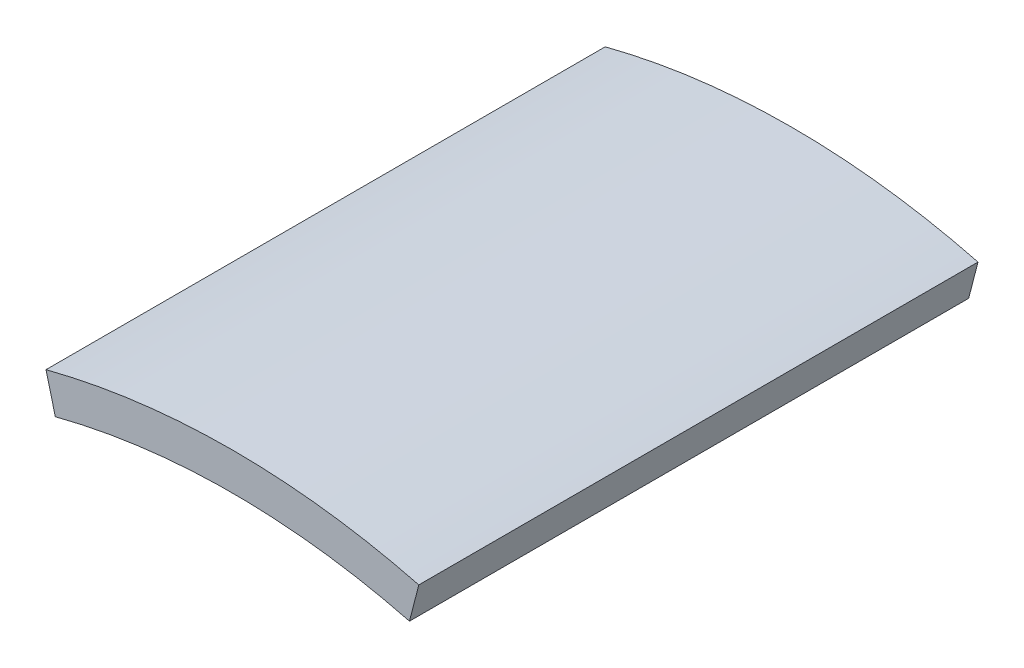
ISO-10303-21;
HEADER;
FILE_DESCRIPTION(('STEP AP214'),'2;1');
FILE_NAME('part.step','',(''),(''),'','','');
FILE_SCHEMA(('AUTOMOTIVE_DESIGN { 1 0 10303 214 1 1 1 1 }'));
ENDSEC;
DATA;
#1=APPLICATION_CONTEXT('core data for automotive mechanical design processes');
#2=APPLICATION_PROTOCOL_DEFINITION('international standard','automotive_design',2000,#1);
#3=PRODUCT_CONTEXT('',#1,'mechanical');
#4=PRODUCT('Part','Part','',(#3));
#5=PRODUCT_RELATED_PRODUCT_CATEGORY('part','',(#4));
#6=PRODUCT_DEFINITION_FORMATION('','',#4);
#7=PRODUCT_DEFINITION_CONTEXT('part definition',#1,'design');
#8=PRODUCT_DEFINITION('design','',#6,#7);
#9=PRODUCT_DEFINITION_SHAPE('','',#8);
#10=(LENGTH_UNIT() NAMED_UNIT(*) SI_UNIT(.MILLI.,.METRE.));
#11=(NAMED_UNIT(*) PLANE_ANGLE_UNIT() SI_UNIT($,.RADIAN.));
#12=(NAMED_UNIT(*) SI_UNIT($,.STERADIAN.) SOLID_ANGLE_UNIT());
#13=UNCERTAINTY_MEASURE_WITH_UNIT(LENGTH_MEASURE(1.E-05),#10,'distance_accuracy_value','');
#14=(GEOMETRIC_REPRESENTATION_CONTEXT(3) GLOBAL_UNCERTAINTY_ASSIGNED_CONTEXT((#13)) GLOBAL_UNIT_ASSIGNED_CONTEXT((#10,
#11,#12)) REPRESENTATION_CONTEXT('',''));
#15=CARTESIAN_POINT('',(0.,0.,0.));
#16=DIRECTION('',(0.,0.,1.));
#17=DIRECTION('',(1.,0.,0.));
#18=AXIS2_PLACEMENT_3D('',#15,#16,#17);
#19=CARTESIAN_POINT('',(10.,-38.7298334620742,30.));
#20=DIRECTION('',(0.,0.,-1.));
#21=DIRECTION('',(-1.,0.,0.));
#22=AXIS2_PLACEMENT_3D('',#19,#20,#21);
#23=CYLINDRICAL_SURFACE('',#22,40.);
#24=CARTESIAN_POINT('',(10.,-38.7298334620742,0.));
#25=DIRECTION('',(0.,0.,1.));
#26=DIRECTION('',(-1.,0.,0.));
#27=AXIS2_PLACEMENT_3D('',#24,#25,#26);
#28=CIRCLE('',#27,40.);
#29=CARTESIAN_POINT('',(20.,0.,0.));
#30=VERTEX_POINT('',#29);
#31=CARTESIAN_POINT('',(0.,0.,0.));
#32=VERTEX_POINT('',#31);
#33=EDGE_CURVE('E96',#30,#32,#28,.T.);
#34=ORIENTED_EDGE('',*,*,#33,.T.);
#35=DIRECTION('',(0.,0.,-1.));
#36=VECTOR('',#35,1.);
#37=CARTESIAN_POINT('',(0.,0.,30.));
#38=LINE('',#37,#36);
#39=CARTESIAN_POINT('',(0.,0.,30.));
#40=VERTEX_POINT('',#39);
#41=EDGE_CURVE('E11',#40,#32,#38,.T.);
#42=ORIENTED_EDGE('',*,*,#41,.F.);
#43=CARTESIAN_POINT('',(10.,-38.7298334620742,30.));
#44=DIRECTION('',(0.,0.,1.));
#45=DIRECTION('',(-1.,0.,0.));
#46=AXIS2_PLACEMENT_3D('',#43,#44,#45);
#47=CIRCLE('',#46,40.);
#48=CARTESIAN_POINT('',(20.,0.,30.));
#49=VERTEX_POINT('',#48);
#50=EDGE_CURVE('E84',#49,#40,#47,.T.);
#51=ORIENTED_EDGE('',*,*,#50,.F.);
#52=DIRECTION('',(0.,0.,-1.));
#53=VECTOR('',#52,1.);
#54=CARTESIAN_POINT('',(20.,0.,30.));
#55=LINE('',#54,#53);
#56=EDGE_CURVE('E92',#49,#30,#55,.T.);
#57=ORIENTED_EDGE('',*,*,#56,.T.);
#58=EDGE_LOOP('',(#34,#42,#51,#57));
#59=FACE_BOUND('',#58,.T.);
#60=ADVANCED_FACE('F33',(#59),#23,.T.);
#61=CARTESIAN_POINT('',(0.,0.,30.));
#62=DIRECTION('',(0.968245836551855,0.249999999999998,0.));
#63=DIRECTION('',(-0.249999999999998,0.968245836551855,0.));
#64=AXIS2_PLACEMENT_3D('',#61,#62,#63);
#65=PLANE('',#64);
#66=DIRECTION('',(0.249999999999998,-0.968245836551855,0.));
#67=VECTOR('',#66,1.);
#68=CARTESIAN_POINT('',(0.,0.,0.));
#69=LINE('',#68,#67);
#70=CARTESIAN_POINT('',(0.499999999999997,-1.93649167310371,0.));
#71=VERTEX_POINT('',#70);
#72=EDGE_CURVE('E88',#32,#71,#69,.T.);
#73=ORIENTED_EDGE('',*,*,#72,.T.);
#74=DIRECTION('',(0.,0.,-1.));
#75=VECTOR('',#74,1.);
#76=CARTESIAN_POINT('',(0.499999999999997,-1.93649167310371,30.));
#77=LINE('',#76,#75);
#78=CARTESIAN_POINT('',(0.499999999999997,-1.93649167310371,30.));
#79=VERTEX_POINT('',#78);
#80=EDGE_CURVE('E41',#79,#71,#77,.T.);
#81=ORIENTED_EDGE('',*,*,#80,.F.);
#82=DIRECTION('',(0.249999999999998,-0.968245836551855,0.));
#83=VECTOR('',#82,1.);
#84=CARTESIAN_POINT('',(0.,0.,30.));
#85=LINE('',#84,#83);
#86=EDGE_CURVE('E79',#40,#79,#85,.T.);
#87=ORIENTED_EDGE('',*,*,#86,.F.);
#88=ORIENTED_EDGE('',*,*,#41,.T.);
#89=EDGE_LOOP('',(#73,#81,#87,#88));
#90=FACE_BOUND('',#89,.T.);
#91=ADVANCED_FACE('F87',(#90),#65,.F.);
#92=CARTESIAN_POINT('',(10.,-38.7298334620742,30.));
#93=DIRECTION('',(0.,0.,-1.));
#94=DIRECTION('',(-1.,0.,0.));
#95=AXIS2_PLACEMENT_3D('',#92,#93,#94);
#96=CYLINDRICAL_SURFACE('',#95,38.);
#97=CARTESIAN_POINT('',(10.,-38.7298334620742,0.));
#98=DIRECTION('',(0.,0.,-1.));
#99=DIRECTION('',(-1.,0.,0.));
#100=AXIS2_PLACEMENT_3D('',#97,#98,#99);
#101=CIRCLE('',#100,38.);
#102=CARTESIAN_POINT('',(19.5,-1.93649167310371,0.));
#103=VERTEX_POINT('',#102);
#104=EDGE_CURVE('E66',#71,#103,#101,.T.);
#105=ORIENTED_EDGE('',*,*,#104,.T.);
#106=DIRECTION('',(0.,0.,-1.));
#107=VECTOR('',#106,1.);
#108=CARTESIAN_POINT('',(19.5,-1.93649167310371,30.));
#109=LINE('',#108,#107);
#110=CARTESIAN_POINT('',(19.5,-1.93649167310371,30.));
#111=VERTEX_POINT('',#110);
#112=EDGE_CURVE('E89',#111,#103,#109,.T.);
#113=ORIENTED_EDGE('',*,*,#112,.F.);
#114=CARTESIAN_POINT('',(10.,-38.7298334620742,30.));
#115=DIRECTION('',(0.,0.,-1.));
#116=DIRECTION('',(-1.,0.,0.));
#117=AXIS2_PLACEMENT_3D('',#114,#115,#116);
#118=CIRCLE('',#117,38.);
#119=EDGE_CURVE('E82',#79,#111,#118,.T.);
#120=ORIENTED_EDGE('',*,*,#119,.F.);
#121=ORIENTED_EDGE('',*,*,#80,.T.);
#122=EDGE_LOOP('',(#105,#113,#120,#121));
#123=FACE_BOUND('',#122,.T.);
#124=ADVANCED_FACE('F90',(#123),#96,.F.);
#125=CARTESIAN_POINT('',(20.,0.,30.));
#126=DIRECTION('',(-0.968245836551854,0.25,0.));
#127=DIRECTION('',(-0.25,-0.968245836551854,0.));
#128=AXIS2_PLACEMENT_3D('',#125,#126,#127);
#129=PLANE('',#128);
#130=DIRECTION('',(0.25,0.968245836551854,0.));
#131=VECTOR('',#130,1.);
#132=CARTESIAN_POINT('',(20.,0.,0.));
#133=LINE('',#132,#131);
#134=EDGE_CURVE('E72',#103,#30,#133,.T.);
#135=ORIENTED_EDGE('',*,*,#134,.T.);
#136=ORIENTED_EDGE('',*,*,#56,.F.);
#137=DIRECTION('',(0.25,0.968245836551854,0.));
#138=VECTOR('',#137,1.);
#139=CARTESIAN_POINT('',(20.,0.,30.));
#140=LINE('',#139,#138);
#141=EDGE_CURVE('E49',#111,#49,#140,.T.);
#142=ORIENTED_EDGE('',*,*,#141,.F.);
#143=ORIENTED_EDGE('',*,*,#112,.T.);
#144=EDGE_LOOP('',(#135,#136,#142,#143));
#145=FACE_BOUND('',#144,.T.);
#146=ADVANCED_FACE('F103',(#145),#129,.F.);
#147=CARTESIAN_POINT('',(10.,-38.7298334620742,30.));
#148=DIRECTION('',(0.,0.,-1.));
#149=DIRECTION('',(-1.,0.,0.));
#150=AXIS2_PLACEMENT_3D('',#147,#148,#149);
#151=PLANE('',#150);
#152=ORIENTED_EDGE('',*,*,#50,.T.);
#153=ORIENTED_EDGE('',*,*,#86,.T.);
#154=ORIENTED_EDGE('',*,*,#119,.T.);
#155=ORIENTED_EDGE('',*,*,#141,.T.);
#156=EDGE_LOOP('',(#152,#153,#154,#155));
#157=FACE_BOUND('',#156,.T.);
#158=ADVANCED_FACE('F80',(#157),#151,.F.);
#159=CARTESIAN_POINT('',(10.,-38.7298334620742,0.));
#160=DIRECTION('',(0.,0.,-1.));
#161=DIRECTION('',(-1.,0.,0.));
#162=AXIS2_PLACEMENT_3D('',#159,#160,#161);
#163=PLANE('',#162);
#164=ORIENTED_EDGE('',*,*,#33,.F.);
#165=ORIENTED_EDGE('',*,*,#134,.F.);
#166=ORIENTED_EDGE('',*,*,#104,.F.);
#167=ORIENTED_EDGE('',*,*,#72,.F.);
#168=EDGE_LOOP('',(#164,#165,#166,#167));
#169=FACE_BOUND('',#168,.T.);
#170=ADVANCED_FACE('F106',(#169),#163,.T.);
#171=CLOSED_SHELL('',(#60,#91,#124,#146,#158,#170));
#172=MANIFOLD_SOLID_BREP('B2',#171);
#173=ADVANCED_BREP_SHAPE_REPRESENTATION('',(#18,#172),#14);
#174=SHAPE_DEFINITION_REPRESENTATION(#9,#173);
ENDSEC;
END-ISO-10303-21;
